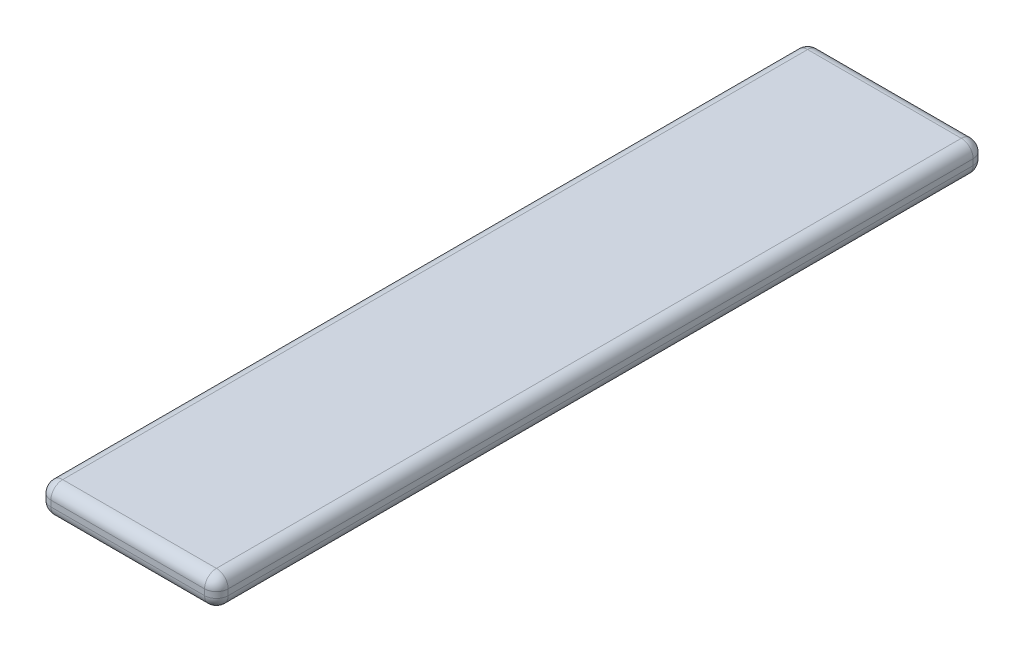
ISO-10303-21;
HEADER;
FILE_DESCRIPTION(('STEP AP214'),'2;1');
FILE_NAME('part.step','',(''),(''),'','','');
FILE_SCHEMA(('AUTOMOTIVE_DESIGN { 1 0 10303 214 1 1 1 1 }'));
ENDSEC;
DATA;
#1=APPLICATION_CONTEXT('core data for automotive mechanical design processes');
#2=APPLICATION_PROTOCOL_DEFINITION('international standard','automotive_design',2000,#1);
#3=PRODUCT_CONTEXT('',#1,'mechanical');
#4=PRODUCT('Part','Part','',(#3));
#5=PRODUCT_RELATED_PRODUCT_CATEGORY('part','',(#4));
#6=PRODUCT_DEFINITION_FORMATION('','',#4);
#7=PRODUCT_DEFINITION_CONTEXT('part definition',#1,'design');
#8=PRODUCT_DEFINITION('design','',#6,#7);
#9=PRODUCT_DEFINITION_SHAPE('','',#8);
#10=(LENGTH_UNIT() NAMED_UNIT(*) SI_UNIT(.MILLI.,.METRE.));
#11=(NAMED_UNIT(*) PLANE_ANGLE_UNIT() SI_UNIT($,.RADIAN.));
#12=(NAMED_UNIT(*) SI_UNIT($,.STERADIAN.) SOLID_ANGLE_UNIT());
#13=UNCERTAINTY_MEASURE_WITH_UNIT(LENGTH_MEASURE(1.E-05),#10,'distance_accuracy_value','');
#14=(GEOMETRIC_REPRESENTATION_CONTEXT(3) GLOBAL_UNCERTAINTY_ASSIGNED_CONTEXT((#13)) GLOBAL_UNIT_ASSIGNED_CONTEXT((#10,
#11,#12)) REPRESENTATION_CONTEXT('',''));
#15=CARTESIAN_POINT('',(0.,0.,0.));
#16=DIRECTION('',(0.,0.,1.));
#17=DIRECTION('',(1.,0.,0.));
#18=AXIS2_PLACEMENT_3D('',#15,#16,#17);
#19=CARTESIAN_POINT('',(0.,6.35,-165.1));
#20=DIRECTION('',(0.,0.,-1.));
#21=DIRECTION('',(-1.,0.,0.));
#22=AXIS2_PLACEMENT_3D('',#19,#20,#21);
#23=PLANE('',#22);
#24=DIRECTION('',(1.,0.,0.));
#25=VECTOR('',#24,1.);
#26=CARTESIAN_POINT('',(0.,2.54,-165.1));
#27=LINE('',#26,#25);
#28=CARTESIAN_POINT('',(35.56,2.54,-165.1));
#29=VERTEX_POINT('',#28);
#30=CARTESIAN_POINT('',(2.54,2.54,-165.1));
#31=VERTEX_POINT('',#30);
#32=EDGE_CURVE('E191',#29,#31,#27,.F.);
#33=ORIENTED_EDGE('',*,*,#32,.T.);
#34=DIRECTION('',(0.,-1.,0.));
#35=VECTOR('',#34,1.);
#36=CARTESIAN_POINT('',(2.54,6.35,-165.1));
#37=LINE('',#36,#35);
#38=CARTESIAN_POINT('',(2.54,3.81,-165.1));
#39=VERTEX_POINT('',#38);
#40=EDGE_CURVE('E194',#31,#39,#37,.F.);
#41=ORIENTED_EDGE('',*,*,#40,.T.);
#42=DIRECTION('',(1.,0.,0.));
#43=VECTOR('',#42,1.);
#44=CARTESIAN_POINT('',(0.,3.81,-165.1));
#45=LINE('',#44,#43);
#46=CARTESIAN_POINT('',(35.56,3.81,-165.1));
#47=VERTEX_POINT('',#46);
#48=EDGE_CURVE('E189',#39,#47,#45,.T.);
#49=ORIENTED_EDGE('',*,*,#48,.T.);
#50=DIRECTION('',(0.,-1.,0.));
#51=VECTOR('',#50,1.);
#52=CARTESIAN_POINT('',(35.56,0.,-165.1));
#53=LINE('',#52,#51);
#54=EDGE_CURVE('E187',#47,#29,#53,.T.);
#55=ORIENTED_EDGE('',*,*,#54,.T.);
#56=EDGE_LOOP('',(#33,#41,#49,#55));
#57=FACE_BOUND('',#56,.T.);
#58=ADVANCED_FACE('F35',(#57),#23,.T.);
#59=CARTESIAN_POINT('',(0.,6.35,0.));
#60=DIRECTION('',(-1.,0.,0.));
#61=DIRECTION('',(0.,0.,1.));
#62=AXIS2_PLACEMENT_3D('',#59,#60,#61);
#63=PLANE('',#62);
#64=DIRECTION('',(0.,-1.,0.));
#65=VECTOR('',#64,1.);
#66=CARTESIAN_POINT('',(0.,6.35,-162.56));
#67=LINE('',#66,#65);
#68=CARTESIAN_POINT('',(0.,3.81,-162.56));
#69=VERTEX_POINT('',#68);
#70=CARTESIAN_POINT('',(0.,2.54,-162.56));
#71=VERTEX_POINT('',#70);
#72=EDGE_CURVE('E164',#69,#71,#67,.T.);
#73=ORIENTED_EDGE('',*,*,#72,.T.);
#74=DIRECTION('',(0.,0.,-1.));
#75=VECTOR('',#74,1.);
#76=CARTESIAN_POINT('',(0.,2.54,0.));
#77=LINE('',#76,#75);
#78=CARTESIAN_POINT('',(0.,2.54,-2.54));
#79=VERTEX_POINT('',#78);
#80=EDGE_CURVE('E167',#71,#79,#77,.F.);
#81=ORIENTED_EDGE('',*,*,#80,.T.);
#82=DIRECTION('',(0.,-1.,0.));
#83=VECTOR('',#82,1.);
#84=CARTESIAN_POINT('',(0.,6.35,-2.54));
#85=LINE('',#84,#83);
#86=CARTESIAN_POINT('',(0.,3.81,-2.54));
#87=VERTEX_POINT('',#86);
#88=EDGE_CURVE('E130',#79,#87,#85,.F.);
#89=ORIENTED_EDGE('',*,*,#88,.T.);
#90=DIRECTION('',(0.,0.,-1.));
#91=VECTOR('',#90,1.);
#92=CARTESIAN_POINT('',(0.,3.81,0.));
#93=LINE('',#92,#91);
#94=EDGE_CURVE('E159',#87,#69,#93,.T.);
#95=ORIENTED_EDGE('',*,*,#94,.T.);
#96=EDGE_LOOP('',(#73,#81,#89,#95));
#97=FACE_BOUND('',#96,.T.);
#98=ADVANCED_FACE('F294',(#97),#63,.T.);
#99=CARTESIAN_POINT('',(0.,6.35,0.));
#100=DIRECTION('',(0.,0.,-1.));
#101=DIRECTION('',(-1.,0.,0.));
#102=AXIS2_PLACEMENT_3D('',#99,#100,#101);
#103=PLANE('',#102);
#104=DIRECTION('',(0.,-1.,0.));
#105=VECTOR('',#104,1.);
#106=CARTESIAN_POINT('',(35.56,6.35,0.));
#107=LINE('',#106,#105);
#108=CARTESIAN_POINT('',(35.56,2.54,0.));
#109=VERTEX_POINT('',#108);
#110=CARTESIAN_POINT('',(35.56,3.81,0.));
#111=VERTEX_POINT('',#110);
#112=EDGE_CURVE('E152',#109,#111,#107,.F.);
#113=ORIENTED_EDGE('',*,*,#112,.T.);
#114=DIRECTION('',(1.,0.,0.));
#115=VECTOR('',#114,1.);
#116=CARTESIAN_POINT('',(0.,3.81,0.));
#117=LINE('',#116,#115);
#118=CARTESIAN_POINT('',(2.54,3.81,0.));
#119=VERTEX_POINT('',#118);
#120=EDGE_CURVE('E156',#111,#119,#117,.F.);
#121=ORIENTED_EDGE('',*,*,#120,.T.);
#122=DIRECTION('',(0.,-1.,0.));
#123=VECTOR('',#122,1.);
#124=CARTESIAN_POINT('',(2.54,0.,0.));
#125=LINE('',#124,#123);
#126=CARTESIAN_POINT('',(2.54,2.54,0.));
#127=VERTEX_POINT('',#126);
#128=EDGE_CURVE('E128',#119,#127,#125,.T.);
#129=ORIENTED_EDGE('',*,*,#128,.T.);
#130=DIRECTION('',(1.,0.,0.));
#131=VECTOR('',#130,1.);
#132=CARTESIAN_POINT('',(0.,2.54,0.));
#133=LINE('',#132,#131);
#134=EDGE_CURVE('E146',#127,#109,#133,.T.);
#135=ORIENTED_EDGE('',*,*,#134,.T.);
#136=EDGE_LOOP('',(#113,#121,#129,#135));
#137=FACE_BOUND('',#136,.T.);
#138=ADVANCED_FACE('F154',(#137),#103,.F.);
#139=CARTESIAN_POINT('',(38.1,6.35,0.));
#140=DIRECTION('',(-1.,0.,0.));
#141=DIRECTION('',(0.,0.,1.));
#142=AXIS2_PLACEMENT_3D('',#139,#140,#141);
#143=PLANE('',#142);
#144=DIRECTION('',(0.,-1.,0.));
#145=VECTOR('',#144,1.);
#146=CARTESIAN_POINT('',(38.1,6.35,-162.56));
#147=LINE('',#146,#145);
#148=CARTESIAN_POINT('',(38.1,2.54,-162.56));
#149=VERTEX_POINT('',#148);
#150=CARTESIAN_POINT('',(38.1,3.81,-162.56));
#151=VERTEX_POINT('',#150);
#152=EDGE_CURVE('E171',#149,#151,#147,.F.);
#153=ORIENTED_EDGE('',*,*,#152,.T.);
#154=DIRECTION('',(0.,0.,-1.));
#155=VECTOR('',#154,1.);
#156=CARTESIAN_POINT('',(38.1,3.81,0.));
#157=LINE('',#156,#155);
#158=CARTESIAN_POINT('',(38.1,3.81,-2.54));
#159=VERTEX_POINT('',#158);
#160=EDGE_CURVE('E176',#151,#159,#157,.F.);
#161=ORIENTED_EDGE('',*,*,#160,.T.);
#162=DIRECTION('',(0.,-1.,0.));
#163=VECTOR('',#162,1.);
#164=CARTESIAN_POINT('',(38.1,6.35,-2.54));
#165=LINE('',#164,#163);
#166=CARTESIAN_POINT('',(38.1,2.54,-2.54));
#167=VERTEX_POINT('',#166);
#168=EDGE_CURVE('E173',#159,#167,#165,.T.);
#169=ORIENTED_EDGE('',*,*,#168,.T.);
#170=DIRECTION('',(0.,0.,-1.));
#171=VECTOR('',#170,1.);
#172=CARTESIAN_POINT('',(38.1,2.54,0.));
#173=LINE('',#172,#171);
#174=EDGE_CURVE('E169',#167,#149,#173,.T.);
#175=ORIENTED_EDGE('',*,*,#174,.T.);
#176=EDGE_LOOP('',(#153,#161,#169,#175));
#177=FACE_BOUND('',#176,.T.);
#178=ADVANCED_FACE('F304',(#177),#143,.F.);
#179=CARTESIAN_POINT('',(0.,6.35,0.));
#180=DIRECTION('',(0.,1.,0.));
#181=DIRECTION('',(0.,0.,1.));
#182=AXIS2_PLACEMENT_3D('',#179,#180,#181);
#183=PLANE('',#182);
#184=DIRECTION('',(1.,0.,0.));
#185=VECTOR('',#184,1.);
#186=CARTESIAN_POINT('',(38.1,6.35,-2.54));
#187=LINE('',#186,#185);
#188=CARTESIAN_POINT('',(2.54,6.35,-2.54));
#189=VERTEX_POINT('',#188);
#190=CARTESIAN_POINT('',(35.56,6.35,-2.54));
#191=VERTEX_POINT('',#190);
#192=EDGE_CURVE('E55',#189,#191,#187,.T.);
#193=ORIENTED_EDGE('',*,*,#192,.T.);
#194=DIRECTION('',(0.,0.,-1.));
#195=VECTOR('',#194,1.);
#196=CARTESIAN_POINT('',(35.56,6.35,-165.1));
#197=LINE('',#196,#195);
#198=CARTESIAN_POINT('',(35.56,6.35,-162.56));
#199=VERTEX_POINT('',#198);
#200=EDGE_CURVE('E11',#191,#199,#197,.T.);
#201=ORIENTED_EDGE('',*,*,#200,.T.);
#202=DIRECTION('',(1.,0.,0.));
#203=VECTOR('',#202,1.);
#204=CARTESIAN_POINT('',(0.,6.35,-162.56));
#205=LINE('',#204,#203);
#206=CARTESIAN_POINT('',(2.54,6.35,-162.56));
#207=VERTEX_POINT('',#206);
#208=EDGE_CURVE('E44',#199,#207,#205,.F.);
#209=ORIENTED_EDGE('',*,*,#208,.T.);
#210=DIRECTION('',(0.,0.,-1.));
#211=VECTOR('',#210,1.);
#212=CARTESIAN_POINT('',(2.54,6.35,0.));
#213=LINE('',#212,#211);
#214=EDGE_CURVE('E196',#207,#189,#213,.F.);
#215=ORIENTED_EDGE('',*,*,#214,.T.);
#216=EDGE_LOOP('',(#193,#201,#209,#215));
#217=FACE_BOUND('',#216,.T.);
#218=ADVANCED_FACE('F271',(#217),#183,.T.);
#219=CARTESIAN_POINT('',(0.,0.,0.));
#220=DIRECTION('',(0.,1.,0.));
#221=DIRECTION('',(0.,0.,1.));
#222=AXIS2_PLACEMENT_3D('',#219,#220,#221);
#223=PLANE('',#222);
#224=DIRECTION('',(0.,0.,-1.));
#225=VECTOR('',#224,1.);
#226=CARTESIAN_POINT('',(2.54,0.,-165.1));
#227=LINE('',#226,#225);
#228=CARTESIAN_POINT('',(2.54,0.,-2.54));
#229=VERTEX_POINT('',#228);
#230=CARTESIAN_POINT('',(2.54,0.,-162.56));
#231=VERTEX_POINT('',#230);
#232=EDGE_CURVE('E178',#229,#231,#227,.T.);
#233=ORIENTED_EDGE('',*,*,#232,.T.);
#234=DIRECTION('',(1.,0.,0.));
#235=VECTOR('',#234,1.);
#236=CARTESIAN_POINT('',(38.1,0.,-162.56));
#237=LINE('',#236,#235);
#238=CARTESIAN_POINT('',(35.56,0.,-162.56));
#239=VERTEX_POINT('',#238);
#240=EDGE_CURVE('E184',#231,#239,#237,.T.);
#241=ORIENTED_EDGE('',*,*,#240,.T.);
#242=DIRECTION('',(0.,0.,-1.));
#243=VECTOR('',#242,1.);
#244=CARTESIAN_POINT('',(35.56,0.,0.));
#245=LINE('',#244,#243);
#246=CARTESIAN_POINT('',(35.56,0.,-2.54));
#247=VERTEX_POINT('',#246);
#248=EDGE_CURVE('E182',#239,#247,#245,.F.);
#249=ORIENTED_EDGE('',*,*,#248,.T.);
#250=DIRECTION('',(1.,0.,0.));
#251=VECTOR('',#250,1.);
#252=CARTESIAN_POINT('',(0.,0.,-2.54));
#253=LINE('',#252,#251);
#254=EDGE_CURVE('E180',#247,#229,#253,.F.);
#255=ORIENTED_EDGE('',*,*,#254,.T.);
#256=EDGE_LOOP('',(#233,#241,#249,#255));
#257=FACE_BOUND('',#256,.T.);
#258=ADVANCED_FACE('F470',(#257),#223,.F.);
#259=CARTESIAN_POINT('',(35.56,6.35,-162.56));
#260=DIRECTION('',(0.,1.,0.));
#261=DIRECTION('',(0.,0.,1.));
#262=AXIS2_PLACEMENT_3D('',#259,#260,#261);
#263=CYLINDRICAL_SURFACE('',#262,2.54);
#264=CARTESIAN_POINT('',(35.56,3.81,-162.56));
#265=DIRECTION('',(0.,1.,0.));
#266=DIRECTION('',(0.,0.,1.));
#267=AXIS2_PLACEMENT_3D('',#264,#265,#266);
#268=CIRCLE('',#267,2.54);
#269=EDGE_CURVE('E39',#151,#47,#268,.T.);
#270=ORIENTED_EDGE('',*,*,#269,.F.);
#271=ORIENTED_EDGE('',*,*,#152,.F.);
#272=CARTESIAN_POINT('',(35.56,2.54,-162.56));
#273=DIRECTION('',(0.,-1.,0.));
#274=DIRECTION('',(0.,0.,-1.));
#275=AXIS2_PLACEMENT_3D('',#272,#273,#274);
#276=CIRCLE('',#275,2.54);
#277=EDGE_CURVE('E249',#29,#149,#276,.T.);
#278=ORIENTED_EDGE('',*,*,#277,.F.);
#279=ORIENTED_EDGE('',*,*,#54,.F.);
#280=EDGE_LOOP('',(#270,#271,#278,#279));
#281=FACE_BOUND('',#280,.T.);
#282=ADVANCED_FACE('F37',(#281),#263,.T.);
#283=CARTESIAN_POINT('',(35.56,3.81,-162.56));
#284=DIRECTION('',(0.,0.,1.));
#285=DIRECTION('',(1.,0.,0.));
#286=AXIS2_PLACEMENT_3D('',#283,#284,#285);
#287=SPHERICAL_SURFACE('',#286,2.54);
#288=CARTESIAN_POINT('',(35.56,3.81,-162.56));
#289=DIRECTION('',(0.,0.,-1.));
#290=DIRECTION('',(-1.,0.,0.));
#291=AXIS2_PLACEMENT_3D('',#288,#289,#290);
#292=CIRCLE('',#291,2.54);
#293=EDGE_CURVE('E245',#151,#199,#292,.F.);
#294=ORIENTED_EDGE('',*,*,#293,.F.);
#295=ORIENTED_EDGE('',*,*,#269,.T.);
#296=CARTESIAN_POINT('',(35.56,3.81,-162.56));
#297=DIRECTION('',(1.,0.,0.));
#298=DIRECTION('',(0.,0.,-1.));
#299=AXIS2_PLACEMENT_3D('',#296,#297,#298);
#300=CIRCLE('',#299,2.54);
#301=EDGE_CURVE('E247',#199,#47,#300,.F.);
#302=ORIENTED_EDGE('',*,*,#301,.F.);
#303=EDGE_LOOP('',(#294,#295,#302));
#304=FACE_BOUND('',#303,.T.);
#305=ADVANCED_FACE('F260',(#304),#287,.T.);
#306=CARTESIAN_POINT('',(35.56,2.54,-162.56));
#307=DIRECTION('',(0.,0.,1.));
#308=DIRECTION('',(1.,0.,0.));
#309=AXIS2_PLACEMENT_3D('',#306,#307,#308);
#310=SPHERICAL_SURFACE('',#309,2.54);
#311=CARTESIAN_POINT('',(35.56,2.54,-162.56));
#312=DIRECTION('',(1.,0.,0.));
#313=DIRECTION('',(0.,0.,-1.));
#314=AXIS2_PLACEMENT_3D('',#311,#312,#313);
#315=CIRCLE('',#314,2.54);
#316=EDGE_CURVE('E239',#29,#239,#315,.F.);
#317=ORIENTED_EDGE('',*,*,#316,.F.);
#318=ORIENTED_EDGE('',*,*,#277,.T.);
#319=CARTESIAN_POINT('',(35.56,2.54,-162.56));
#320=DIRECTION('',(0.,0.,-1.));
#321=DIRECTION('',(-1.,0.,0.));
#322=AXIS2_PLACEMENT_3D('',#319,#320,#321);
#323=CIRCLE('',#322,2.54);
#324=EDGE_CURVE('E242',#239,#149,#323,.F.);
#325=ORIENTED_EDGE('',*,*,#324,.F.);
#326=EDGE_LOOP('',(#317,#318,#325));
#327=FACE_BOUND('',#326,.T.);
#328=ADVANCED_FACE('F446',(#327),#310,.T.);
#329=CARTESIAN_POINT('',(0.,3.81,-162.56));
#330=DIRECTION('',(1.,0.,0.));
#331=DIRECTION('',(0.,0.,-1.));
#332=AXIS2_PLACEMENT_3D('',#329,#330,#331);
#333=CYLINDRICAL_SURFACE('',#332,2.54);
#334=ORIENTED_EDGE('',*,*,#301,.T.);
#335=ORIENTED_EDGE('',*,*,#48,.F.);
#336=CARTESIAN_POINT('',(2.54,3.81,-162.56));
#337=DIRECTION('',(-1.,0.,0.));
#338=DIRECTION('',(0.,0.,1.));
#339=AXIS2_PLACEMENT_3D('',#336,#337,#338);
#340=CIRCLE('',#339,2.54);
#341=EDGE_CURVE('E233',#207,#39,#340,.T.);
#342=ORIENTED_EDGE('',*,*,#341,.F.);
#343=ORIENTED_EDGE('',*,*,#208,.F.);
#344=EDGE_LOOP('',(#334,#335,#342,#343));
#345=FACE_BOUND('',#344,.T.);
#346=ADVANCED_FACE('F268',(#345),#333,.T.);
#347=CARTESIAN_POINT('',(35.56,3.81,0.));
#348=DIRECTION('',(0.,0.,1.));
#349=DIRECTION('',(1.,0.,0.));
#350=AXIS2_PLACEMENT_3D('',#347,#348,#349);
#351=CYLINDRICAL_SURFACE('',#350,2.54);
#352=ORIENTED_EDGE('',*,*,#293,.T.);
#353=ORIENTED_EDGE('',*,*,#200,.F.);
#354=CARTESIAN_POINT('',(35.56,3.81,-2.54));
#355=DIRECTION('',(0.,0.,1.));
#356=DIRECTION('',(1.,0.,0.));
#357=AXIS2_PLACEMENT_3D('',#354,#355,#356);
#358=CIRCLE('',#357,2.54);
#359=EDGE_CURVE('E230',#159,#191,#358,.T.);
#360=ORIENTED_EDGE('',*,*,#359,.F.);
#361=ORIENTED_EDGE('',*,*,#160,.F.);
#362=EDGE_LOOP('',(#352,#353,#360,#361));
#363=FACE_BOUND('',#362,.T.);
#364=ADVANCED_FACE('F427',(#363),#351,.T.);
#365=CARTESIAN_POINT('',(35.56,6.35,-2.54));
#366=DIRECTION('',(0.,-1.,0.));
#367=DIRECTION('',(0.,0.,-1.));
#368=AXIS2_PLACEMENT_3D('',#365,#366,#367);
#369=CYLINDRICAL_SURFACE('',#368,2.54);
#370=CARTESIAN_POINT('',(35.56,2.54,-2.54));
#371=DIRECTION('',(0.,-1.,0.));
#372=DIRECTION('',(0.,0.,-1.));
#373=AXIS2_PLACEMENT_3D('',#370,#371,#372);
#374=CIRCLE('',#373,2.54);
#375=EDGE_CURVE('E224',#167,#109,#374,.T.);
#376=ORIENTED_EDGE('',*,*,#375,.F.);
#377=ORIENTED_EDGE('',*,*,#168,.F.);
#378=CARTESIAN_POINT('',(35.56,3.81,-2.54));
#379=DIRECTION('',(0.,1.,0.));
#380=DIRECTION('',(0.,0.,1.));
#381=AXIS2_PLACEMENT_3D('',#378,#379,#380);
#382=CIRCLE('',#381,2.54);
#383=EDGE_CURVE('E227',#111,#159,#382,.T.);
#384=ORIENTED_EDGE('',*,*,#383,.F.);
#385=ORIENTED_EDGE('',*,*,#112,.F.);
#386=EDGE_LOOP('',(#376,#377,#384,#385));
#387=FACE_BOUND('',#386,.T.);
#388=ADVANCED_FACE('F417',(#387),#369,.T.);
#389=CARTESIAN_POINT('',(35.56,2.54,0.));
#390=DIRECTION('',(0.,0.,-1.));
#391=DIRECTION('',(-1.,0.,0.));
#392=AXIS2_PLACEMENT_3D('',#389,#390,#391);
#393=CYLINDRICAL_SURFACE('',#392,2.54);
#394=ORIENTED_EDGE('',*,*,#324,.T.);
#395=ORIENTED_EDGE('',*,*,#174,.F.);
#396=CARTESIAN_POINT('',(35.56,2.54,-2.54));
#397=DIRECTION('',(0.,0.,1.));
#398=DIRECTION('',(1.,0.,0.));
#399=AXIS2_PLACEMENT_3D('',#396,#397,#398);
#400=CIRCLE('',#399,2.54);
#401=EDGE_CURVE('E222',#247,#167,#400,.T.);
#402=ORIENTED_EDGE('',*,*,#401,.F.);
#403=ORIENTED_EDGE('',*,*,#248,.F.);
#404=EDGE_LOOP('',(#394,#395,#402,#403));
#405=FACE_BOUND('',#404,.T.);
#406=ADVANCED_FACE('F407',(#405),#393,.T.);
#407=CARTESIAN_POINT('',(0.,2.54,-162.56));
#408=DIRECTION('',(-1.,0.,0.));
#409=DIRECTION('',(0.,0.,1.));
#410=AXIS2_PLACEMENT_3D('',#407,#408,#409);
#411=CYLINDRICAL_SURFACE('',#410,2.54);
#412=ORIENTED_EDGE('',*,*,#316,.T.);
#413=ORIENTED_EDGE('',*,*,#240,.F.);
#414=CARTESIAN_POINT('',(2.54,2.54,-162.56));
#415=DIRECTION('',(-1.,0.,0.));
#416=DIRECTION('',(0.,0.,1.));
#417=AXIS2_PLACEMENT_3D('',#414,#415,#416);
#418=CIRCLE('',#417,2.54);
#419=EDGE_CURVE('E219',#31,#231,#418,.T.);
#420=ORIENTED_EDGE('',*,*,#419,.F.);
#421=ORIENTED_EDGE('',*,*,#32,.F.);
#422=EDGE_LOOP('',(#412,#413,#420,#421));
#423=FACE_BOUND('',#422,.T.);
#424=ADVANCED_FACE('F397',(#423),#411,.T.);
#425=CARTESIAN_POINT('',(2.54,6.35,-162.56));
#426=DIRECTION('',(0.,-1.,0.));
#427=DIRECTION('',(0.,0.,-1.));
#428=AXIS2_PLACEMENT_3D('',#425,#426,#427);
#429=CYLINDRICAL_SURFACE('',#428,2.54);
#430=CARTESIAN_POINT('',(2.54,3.81,-162.56));
#431=DIRECTION('',(0.,1.,0.));
#432=DIRECTION('',(0.,0.,1.));
#433=AXIS2_PLACEMENT_3D('',#430,#431,#432);
#434=CIRCLE('',#433,2.54);
#435=EDGE_CURVE('E236',#39,#69,#434,.T.);
#436=ORIENTED_EDGE('',*,*,#435,.F.);
#437=ORIENTED_EDGE('',*,*,#40,.F.);
#438=CARTESIAN_POINT('',(2.54,2.54,-162.56));
#439=DIRECTION('',(0.,-1.,0.));
#440=DIRECTION('',(0.,0.,-1.));
#441=AXIS2_PLACEMENT_3D('',#438,#439,#440);
#442=CIRCLE('',#441,2.54);
#443=EDGE_CURVE('E217',#71,#31,#442,.T.);
#444=ORIENTED_EDGE('',*,*,#443,.F.);
#445=ORIENTED_EDGE('',*,*,#72,.F.);
#446=EDGE_LOOP('',(#436,#437,#444,#445));
#447=FACE_BOUND('',#446,.T.);
#448=ADVANCED_FACE('F387',(#447),#429,.T.);
#449=CARTESIAN_POINT('',(2.54,3.81,-162.56));
#450=DIRECTION('',(0.,0.,1.));
#451=DIRECTION('',(1.,0.,0.));
#452=AXIS2_PLACEMENT_3D('',#449,#450,#451);
#453=SPHERICAL_SURFACE('',#452,2.54);
#454=ORIENTED_EDGE('',*,*,#341,.T.);
#455=ORIENTED_EDGE('',*,*,#435,.T.);
#456=CARTESIAN_POINT('',(2.54,3.81,-162.56));
#457=DIRECTION('',(0.,0.,-1.));
#458=DIRECTION('',(-1.,0.,0.));
#459=AXIS2_PLACEMENT_3D('',#456,#457,#458);
#460=CIRCLE('',#459,2.54);
#461=EDGE_CURVE('E214',#207,#69,#460,.F.);
#462=ORIENTED_EDGE('',*,*,#461,.F.);
#463=EDGE_LOOP('',(#454,#455,#462));
#464=FACE_BOUND('',#463,.T.);
#465=ADVANCED_FACE('F377',(#464),#453,.T.);
#466=CARTESIAN_POINT('',(35.56,3.81,-2.54));
#467=DIRECTION('',(0.,0.,1.));
#468=DIRECTION('',(1.,0.,0.));
#469=AXIS2_PLACEMENT_3D('',#466,#467,#468);
#470=SPHERICAL_SURFACE('',#469,2.54);
#471=ORIENTED_EDGE('',*,*,#383,.T.);
#472=ORIENTED_EDGE('',*,*,#359,.T.);
#473=CARTESIAN_POINT('',(35.56,3.81,-2.54));
#474=DIRECTION('',(1.,0.,0.));
#475=DIRECTION('',(0.,0.,-1.));
#476=AXIS2_PLACEMENT_3D('',#473,#474,#475);
#477=CIRCLE('',#476,2.54);
#478=EDGE_CURVE('E211',#111,#191,#477,.F.);
#479=ORIENTED_EDGE('',*,*,#478,.F.);
#480=EDGE_LOOP('',(#471,#472,#479));
#481=FACE_BOUND('',#480,.T.);
#482=ADVANCED_FACE('F367',(#481),#470,.T.);
#483=CARTESIAN_POINT('',(35.56,2.54,-2.54));
#484=DIRECTION('',(0.,0.,1.));
#485=DIRECTION('',(1.,0.,0.));
#486=AXIS2_PLACEMENT_3D('',#483,#484,#485);
#487=SPHERICAL_SURFACE('',#486,2.54);
#488=ORIENTED_EDGE('',*,*,#401,.T.);
#489=ORIENTED_EDGE('',*,*,#375,.T.);
#490=CARTESIAN_POINT('',(35.56,2.54,-2.54));
#491=DIRECTION('',(1.,0.,0.));
#492=DIRECTION('',(0.,0.,-1.));
#493=AXIS2_PLACEMENT_3D('',#490,#491,#492);
#494=CIRCLE('',#493,2.54);
#495=EDGE_CURVE('E149',#247,#109,#494,.F.);
#496=ORIENTED_EDGE('',*,*,#495,.F.);
#497=EDGE_LOOP('',(#488,#489,#496));
#498=FACE_BOUND('',#497,.T.);
#499=ADVANCED_FACE('F357',(#498),#487,.T.);
#500=CARTESIAN_POINT('',(2.54,2.54,-162.56));
#501=DIRECTION('',(0.,0.,1.));
#502=DIRECTION('',(1.,0.,0.));
#503=AXIS2_PLACEMENT_3D('',#500,#501,#502);
#504=SPHERICAL_SURFACE('',#503,2.54);
#505=ORIENTED_EDGE('',*,*,#443,.T.);
#506=ORIENTED_EDGE('',*,*,#419,.T.);
#507=CARTESIAN_POINT('',(2.54,2.54,-162.56));
#508=DIRECTION('',(0.,0.,-1.));
#509=DIRECTION('',(-1.,0.,0.));
#510=AXIS2_PLACEMENT_3D('',#507,#508,#509);
#511=CIRCLE('',#510,2.54);
#512=EDGE_CURVE('E207',#71,#231,#511,.F.);
#513=ORIENTED_EDGE('',*,*,#512,.F.);
#514=EDGE_LOOP('',(#505,#506,#513));
#515=FACE_BOUND('',#514,.T.);
#516=ADVANCED_FACE('F348',(#515),#504,.T.);
#517=CARTESIAN_POINT('',(2.54,3.81,0.));
#518=DIRECTION('',(0.,0.,-1.));
#519=DIRECTION('',(-1.,0.,0.));
#520=AXIS2_PLACEMENT_3D('',#517,#518,#519);
#521=CYLINDRICAL_SURFACE('',#520,2.54);
#522=ORIENTED_EDGE('',*,*,#461,.T.);
#523=ORIENTED_EDGE('',*,*,#94,.F.);
#524=CARTESIAN_POINT('',(2.54,3.81,-2.54));
#525=DIRECTION('',(0.,0.,1.));
#526=DIRECTION('',(1.,0.,0.));
#527=AXIS2_PLACEMENT_3D('',#524,#525,#526);
#528=CIRCLE('',#527,2.54);
#529=EDGE_CURVE('E204',#189,#87,#528,.T.);
#530=ORIENTED_EDGE('',*,*,#529,.F.);
#531=ORIENTED_EDGE('',*,*,#214,.F.);
#532=EDGE_LOOP('',(#522,#523,#530,#531));
#533=FACE_BOUND('',#532,.T.);
#534=ADVANCED_FACE('F280',(#533),#521,.T.);
#535=CARTESIAN_POINT('',(0.,3.81,-2.54));
#536=DIRECTION('',(-1.,0.,0.));
#537=DIRECTION('',(0.,0.,1.));
#538=AXIS2_PLACEMENT_3D('',#535,#536,#537);
#539=CYLINDRICAL_SURFACE('',#538,2.54);
#540=ORIENTED_EDGE('',*,*,#478,.T.);
#541=ORIENTED_EDGE('',*,*,#192,.F.);
#542=CARTESIAN_POINT('',(2.54,3.81,-2.54));
#543=DIRECTION('',(-1.,0.,0.));
#544=DIRECTION('',(0.,0.,1.));
#545=AXIS2_PLACEMENT_3D('',#542,#543,#544);
#546=CIRCLE('',#545,2.54);
#547=EDGE_CURVE('E143',#119,#189,#546,.T.);
#548=ORIENTED_EDGE('',*,*,#547,.F.);
#549=ORIENTED_EDGE('',*,*,#120,.F.);
#550=EDGE_LOOP('',(#540,#541,#548,#549));
#551=FACE_BOUND('',#550,.T.);
#552=ADVANCED_FACE('F276',(#551),#539,.T.);
#553=CARTESIAN_POINT('',(0.,2.54,-2.54));
#554=DIRECTION('',(1.,0.,0.));
#555=DIRECTION('',(0.,0.,-1.));
#556=AXIS2_PLACEMENT_3D('',#553,#554,#555);
#557=CYLINDRICAL_SURFACE('',#556,2.54);
#558=ORIENTED_EDGE('',*,*,#495,.T.);
#559=ORIENTED_EDGE('',*,*,#134,.F.);
#560=CARTESIAN_POINT('',(2.54,2.54,-2.54));
#561=DIRECTION('',(-1.,0.,0.));
#562=DIRECTION('',(0.,0.,1.));
#563=AXIS2_PLACEMENT_3D('',#560,#561,#562);
#564=CIRCLE('',#563,2.54);
#565=EDGE_CURVE('E136',#229,#127,#564,.T.);
#566=ORIENTED_EDGE('',*,*,#565,.F.);
#567=ORIENTED_EDGE('',*,*,#254,.F.);
#568=EDGE_LOOP('',(#558,#559,#566,#567));
#569=FACE_BOUND('',#568,.T.);
#570=ADVANCED_FACE('F147',(#569),#557,.T.);
#571=CARTESIAN_POINT('',(2.54,2.54,0.));
#572=DIRECTION('',(0.,0.,1.));
#573=DIRECTION('',(1.,0.,0.));
#574=AXIS2_PLACEMENT_3D('',#571,#572,#573);
#575=CYLINDRICAL_SURFACE('',#574,2.54);
#576=ORIENTED_EDGE('',*,*,#512,.T.);
#577=ORIENTED_EDGE('',*,*,#232,.F.);
#578=CARTESIAN_POINT('',(2.54,2.54,-2.54));
#579=DIRECTION('',(0.,0.,1.));
#580=DIRECTION('',(1.,0.,0.));
#581=AXIS2_PLACEMENT_3D('',#578,#579,#580);
#582=CIRCLE('',#581,2.54);
#583=EDGE_CURVE('E140',#79,#229,#582,.T.);
#584=ORIENTED_EDGE('',*,*,#583,.F.);
#585=ORIENTED_EDGE('',*,*,#80,.F.);
#586=EDGE_LOOP('',(#576,#577,#584,#585));
#587=FACE_BOUND('',#586,.T.);
#588=ADVANCED_FACE('F284',(#587),#575,.T.);
#589=CARTESIAN_POINT('',(2.54,3.81,-2.54));
#590=DIRECTION('',(0.,0.,1.));
#591=DIRECTION('',(1.,0.,0.));
#592=AXIS2_PLACEMENT_3D('',#589,#590,#591);
#593=SPHERICAL_SURFACE('',#592,2.54);
#594=ORIENTED_EDGE('',*,*,#547,.T.);
#595=ORIENTED_EDGE('',*,*,#529,.T.);
#596=CARTESIAN_POINT('',(2.54,3.81,-2.54));
#597=DIRECTION('',(0.,1.,0.));
#598=DIRECTION('',(0.,0.,1.));
#599=AXIS2_PLACEMENT_3D('',#596,#597,#598);
#600=CIRCLE('',#599,2.54);
#601=EDGE_CURVE('E133',#119,#87,#600,.F.);
#602=ORIENTED_EDGE('',*,*,#601,.F.);
#603=EDGE_LOOP('',(#594,#595,#602));
#604=FACE_BOUND('',#603,.T.);
#605=ADVANCED_FACE('F282',(#604),#593,.T.);
#606=CARTESIAN_POINT('',(2.54,2.54,-2.54));
#607=DIRECTION('',(0.,0.,1.));
#608=DIRECTION('',(1.,0.,0.));
#609=AXIS2_PLACEMENT_3D('',#606,#607,#608);
#610=SPHERICAL_SURFACE('',#609,2.54);
#611=ORIENTED_EDGE('',*,*,#583,.T.);
#612=ORIENTED_EDGE('',*,*,#565,.T.);
#613=CARTESIAN_POINT('',(2.54,2.54,-2.54));
#614=DIRECTION('',(0.,-1.,0.));
#615=DIRECTION('',(0.,0.,-1.));
#616=AXIS2_PLACEMENT_3D('',#613,#614,#615);
#617=CIRCLE('',#616,2.54);
#618=EDGE_CURVE('E124',#79,#127,#617,.F.);
#619=ORIENTED_EDGE('',*,*,#618,.F.);
#620=EDGE_LOOP('',(#611,#612,#619));
#621=FACE_BOUND('',#620,.T.);
#622=ADVANCED_FACE('F138',(#621),#610,.T.);
#623=CARTESIAN_POINT('',(2.54,6.35,-2.54));
#624=DIRECTION('',(0.,1.,0.));
#625=DIRECTION('',(0.,0.,1.));
#626=AXIS2_PLACEMENT_3D('',#623,#624,#625);
#627=CYLINDRICAL_SURFACE('',#626,2.54);
#628=ORIENTED_EDGE('',*,*,#601,.T.);
#629=ORIENTED_EDGE('',*,*,#88,.F.);
#630=ORIENTED_EDGE('',*,*,#618,.T.);
#631=ORIENTED_EDGE('',*,*,#128,.F.);
#632=EDGE_LOOP('',(#628,#629,#630,#631));
#633=FACE_BOUND('',#632,.T.);
#634=ADVANCED_FACE('F126',(#633),#627,.T.);
#635=CLOSED_SHELL('',(#58,#98,#138,#178,#218,#258,#282,#305,#328,#346,#364,#388,#406,#424,#448,
#465,#482,#499,#516,#534,#552,#570,#588,#605,#622,#634));
#636=MANIFOLD_SOLID_BREP('B2',#635);
#637=ADVANCED_BREP_SHAPE_REPRESENTATION('',(#18,#636),#14);
#638=SHAPE_DEFINITION_REPRESENTATION(#9,#637);
ENDSEC;
END-ISO-10303-21;
